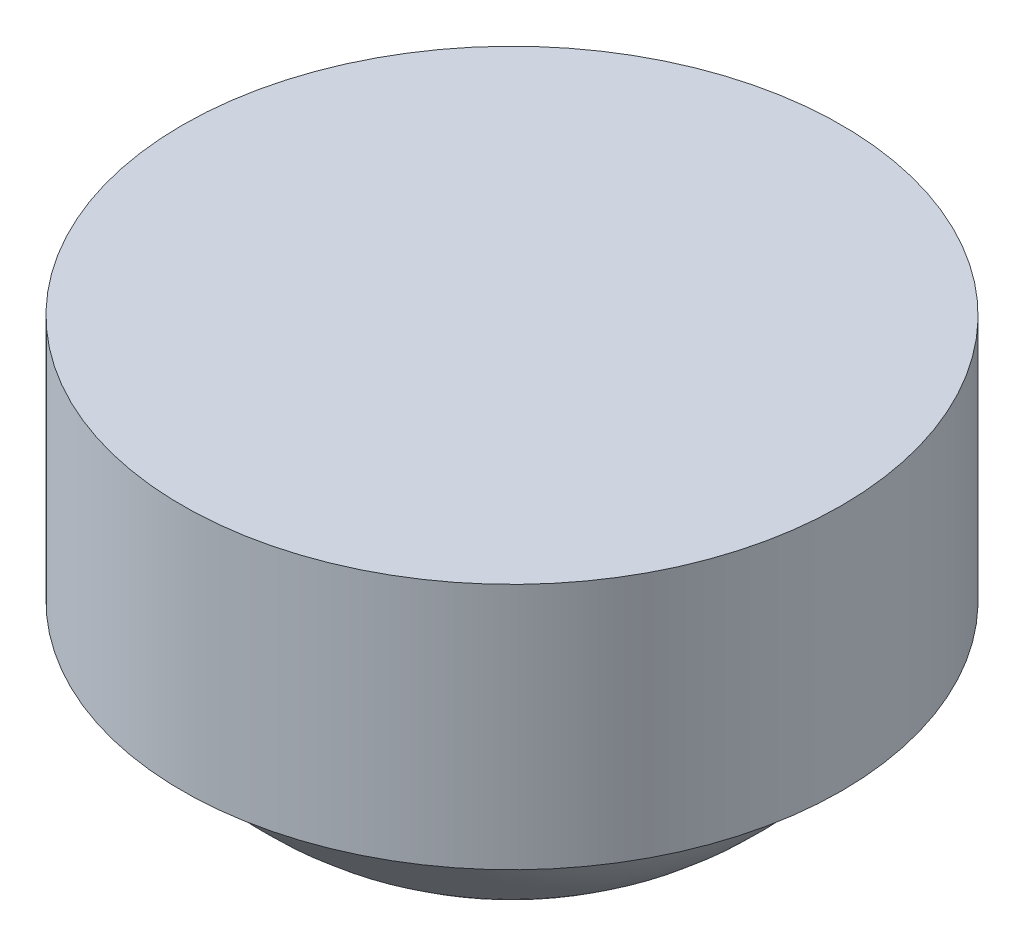
ISO-10303-21;
HEADER;
FILE_DESCRIPTION(('STEP AP214'),'2;1');
FILE_NAME('part.step','',(''),(''),'','','');
FILE_SCHEMA(('AUTOMOTIVE_DESIGN { 1 0 10303 214 1 1 1 1 }'));
ENDSEC;
DATA;
#1=APPLICATION_CONTEXT('core data for automotive mechanical design processes');
#2=APPLICATION_PROTOCOL_DEFINITION('international standard','automotive_design',2000,#1);
#3=PRODUCT_CONTEXT('',#1,'mechanical');
#4=PRODUCT('Part','Part','',(#3));
#5=PRODUCT_RELATED_PRODUCT_CATEGORY('part','',(#4));
#6=PRODUCT_DEFINITION_FORMATION('','',#4);
#7=PRODUCT_DEFINITION_CONTEXT('part definition',#1,'design');
#8=PRODUCT_DEFINITION('design','',#6,#7);
#9=PRODUCT_DEFINITION_SHAPE('','',#8);
#10=(LENGTH_UNIT() NAMED_UNIT(*) SI_UNIT(.MILLI.,.METRE.));
#11=(NAMED_UNIT(*) PLANE_ANGLE_UNIT() SI_UNIT($,.RADIAN.));
#12=(NAMED_UNIT(*) SI_UNIT($,.STERADIAN.) SOLID_ANGLE_UNIT());
#13=UNCERTAINTY_MEASURE_WITH_UNIT(LENGTH_MEASURE(1.E-05),#10,'distance_accuracy_value','');
#14=(GEOMETRIC_REPRESENTATION_CONTEXT(3) GLOBAL_UNCERTAINTY_ASSIGNED_CONTEXT((#13)) GLOBAL_UNIT_ASSIGNED_CONTEXT((#10,
#11,#12)) REPRESENTATION_CONTEXT('',''));
#15=CARTESIAN_POINT('',(0.,0.,0.));
#16=DIRECTION('',(0.,0.,1.));
#17=DIRECTION('',(1.,0.,0.));
#18=AXIS2_PLACEMENT_3D('',#15,#16,#17);
#19=CARTESIAN_POINT('',(0.350000000000247,-67.0000000000004,1.14999999999996));
#20=DIRECTION('',(0.,-1.,0.));
#21=DIRECTION('',(1.,0.,0.));
#22=AXIS2_PLACEMENT_3D('',#19,#20,#21);
#23=PLANE('',#22);
#24=CARTESIAN_POINT('',(4.12780920555633E-13,-67.0000000000004,0.));
#25=DIRECTION('',(0.,-1.,0.));
#26=DIRECTION('',(1.,0.,0.));
#27=AXIS2_PLACEMENT_3D('',#24,#25,#26);
#28=CIRCLE('',#27,20.);
#29=CARTESIAN_POINT('',(20.0000000000004,-67.0000000000005,0.));
#30=VERTEX_POINT('',#29);
#31=EDGE_CURVE('E20',#30,#30,#28,.T.);
#32=ORIENTED_EDGE('',*,*,#31,.F.);
#33=EDGE_LOOP('',(#32));
#34=FACE_BOUND('',#33,.T.);
#35=ADVANCED_FACE('F17',(#34),#23,.F.);
#36=CARTESIAN_POINT('',(4.12780920555633E-13,-67.0000000000004,0.));
#37=DIRECTION('',(0.,-1.,0.));
#38=DIRECTION('',(1.,0.,0.));
#39=AXIS2_PLACEMENT_3D('',#36,#37,#38);
#40=CYLINDRICAL_SURFACE('',#39,20.);
#41=ORIENTED_EDGE('',*,*,#31,.T.);
#42=EDGE_LOOP('',(#41));
#43=FACE_BOUND('',#42,.T.);
#44=CARTESIAN_POINT('',(3.69846514525207E-13,-82.0000000000004,0.));
#45=DIRECTION('',(0.,-1.,0.));
#46=DIRECTION('',(1.,0.,0.));
#47=AXIS2_PLACEMENT_3D('',#44,#45,#46);
#48=CIRCLE('',#47,20.);
#49=CARTESIAN_POINT('',(20.0000000000004,-82.0000000000005,0.));
#50=VERTEX_POINT('',#49);
#51=EDGE_CURVE('E24',#50,#50,#48,.T.);
#52=ORIENTED_EDGE('',*,*,#51,.F.);
#53=EDGE_LOOP('',(#52));
#54=FACE_BOUND('',#53,.T.);
#55=ADVANCED_FACE('F37',(#43,#54),#40,.T.);
#56=CARTESIAN_POINT('',(0.350000000000204,-82.0000000000004,1.14999999999996));
#57=DIRECTION('',(0.,-1.,0.));
#58=DIRECTION('',(1.,0.,0.));
#59=AXIS2_PLACEMENT_3D('',#56,#57,#58);
#60=PLANE('',#59);
#61=CARTESIAN_POINT('',(3.75331710156246E-13,-82.0000000000004,0.));
#62=DIRECTION('',(0.,1.,0.));
#63=DIRECTION('',(-1.,0.,0.));
#64=AXIS2_PLACEMENT_3D('',#61,#62,#63);
#65=CIRCLE('',#64,18.4661853126194);
#66=CARTESIAN_POINT('',(-18.4661853126191,-82.0000000000004,0.));
#67=VERTEX_POINT('',#66);
#68=EDGE_CURVE('E11',#67,#67,#65,.F.);
#69=ORIENTED_EDGE('',*,*,#68,.F.);
#70=EDGE_LOOP('',(#69));
#71=FACE_BOUND('',#70,.T.);
#72=ORIENTED_EDGE('',*,*,#51,.T.);
#73=EDGE_LOOP('',(#72));
#74=FACE_BOUND('',#73,.T.);
#75=ADVANCED_FACE('F31',(#71,#74),#60,.T.);
#76=CARTESIAN_POINT('',(4.03954647509863E-13,-72.0000000000005,0.));
#77=DIRECTION('',(0.,1.,0.));
#78=DIRECTION('',(0.,0.,-1.));
#79=AXIS2_PLACEMENT_3D('',#76,#77,#78);
#80=SPHERICAL_SURFACE('',#79,21.);
#81=CARTESIAN_POINT('',(3.43846479067267E-13,-93.0000000000005,0.));
#82=VERTEX_POINT('',#81);
#83=VERTEX_LOOP('',#82);
#84=FACE_BOUND('',#83,.T.);
#85=ORIENTED_EDGE('',*,*,#68,.T.);
#86=EDGE_LOOP('',(#85));
#87=FACE_BOUND('',#86,.T.);
#88=ADVANCED_FACE('F28',(#84,#87),#80,.T.);
#89=CLOSED_SHELL('',(#35,#55,#75,#88));
#90=MANIFOLD_SOLID_BREP('B1',#89);
#91=ADVANCED_BREP_SHAPE_REPRESENTATION('',(#18,#90),#14);
#92=SHAPE_DEFINITION_REPRESENTATION(#9,#91);
ENDSEC;
END-ISO-10303-21;
